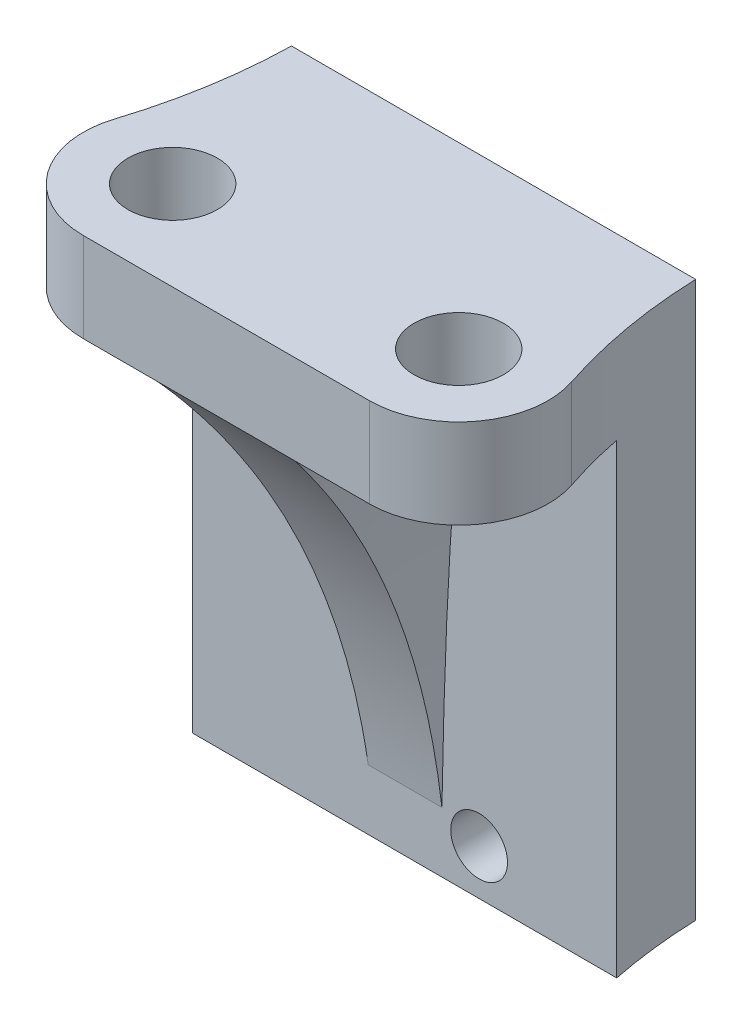
ISO-10303-21;
HEADER;
FILE_DESCRIPTION(('STEP AP214'),'2;1');
FILE_NAME('part.step','',(''),(''),'','','');
FILE_SCHEMA(('AUTOMOTIVE_DESIGN { 1 0 10303 214 1 1 1 1 }'));
ENDSEC;
DATA;
#1=APPLICATION_CONTEXT('core data for automotive mechanical design processes');
#2=APPLICATION_PROTOCOL_DEFINITION('international standard','automotive_design',2000,#1);
#3=PRODUCT_CONTEXT('',#1,'mechanical');
#4=PRODUCT('Part','Part','',(#3));
#5=PRODUCT_RELATED_PRODUCT_CATEGORY('part','',(#4));
#6=PRODUCT_DEFINITION_FORMATION('','',#4);
#7=PRODUCT_DEFINITION_CONTEXT('part definition',#1,'design');
#8=PRODUCT_DEFINITION('design','',#6,#7);
#9=PRODUCT_DEFINITION_SHAPE('','',#8);
#10=(LENGTH_UNIT() NAMED_UNIT(*) SI_UNIT(.MILLI.,.METRE.));
#11=(NAMED_UNIT(*) PLANE_ANGLE_UNIT() SI_UNIT($,.RADIAN.));
#12=(NAMED_UNIT(*) SI_UNIT($,.STERADIAN.) SOLID_ANGLE_UNIT());
#13=UNCERTAINTY_MEASURE_WITH_UNIT(LENGTH_MEASURE(1.E-05),#10,'distance_accuracy_value','');
#14=(GEOMETRIC_REPRESENTATION_CONTEXT(3) GLOBAL_UNCERTAINTY_ASSIGNED_CONTEXT((#13)) GLOBAL_UNIT_ASSIGNED_CONTEXT((#10,
#11,#12)) REPRESENTATION_CONTEXT('',''));
#15=CARTESIAN_POINT('',(0.,0.,0.));
#16=DIRECTION('',(0.,0.,1.));
#17=DIRECTION('',(1.,0.,0.));
#18=AXIS2_PLACEMENT_3D('',#15,#16,#17);
#19=CARTESIAN_POINT('',(0.,0.,5.));
#20=DIRECTION('',(0.,0.,1.));
#21=DIRECTION('',(1.,0.,0.));
#22=AXIS2_PLACEMENT_3D('',#19,#20,#21);
#23=PLANE('',#22);
#24=CARTESIAN_POINT('',(-7.112,3.048,5.));
#25=DIRECTION('',(0.,0.,-1.));
#26=DIRECTION('',(-1.,0.,0.));
#27=AXIS2_PLACEMENT_3D('',#24,#25,#26);
#28=CIRCLE('',#27,1.5875);
#29=CARTESIAN_POINT('',(-8.6995,3.048,5.));
#30=VERTEX_POINT('',#29);
#31=EDGE_CURVE('E171',#30,#30,#28,.T.);
#32=ORIENTED_EDGE('',*,*,#31,.T.);
#33=EDGE_LOOP('',(#32));
#34=FACE_BOUND('',#33,.T.);
#35=DIRECTION('',(1.,0.,0.));
#36=VECTOR('',#35,1.);
#37=CARTESIAN_POINT('',(-24.253,3.88413526493205,4.99999999999999));
#38=LINE('',#37,#36);
#39=CARTESIAN_POINT('',(-13.3135692830577,3.88413526493205,5.));
#40=VERTEX_POINT('',#39);
#41=CARTESIAN_POINT('',(-9.19243071694235,3.88413526493205,5.));
#42=VERTEX_POINT('',#41);
#43=EDGE_CURVE('E290',#40,#42,#38,.T.);
#44=ORIENTED_EDGE('',*,*,#43,.F.);
#45=CARTESIAN_POINT('',(-15.253,26.557,5.));
#46=CARTESIAN_POINT('',(-13.253,26.557,5.));
#47=CARTESIAN_POINT('',(-13.253,-3.443,5.));
#48=(BOUNDED_CURVE() B_SPLINE_CURVE(2,(#45,#46,#47),.UNSPECIFIED.,.F.,
.F.) B_SPLINE_CURVE_WITH_KNOTS((3,3),(0.,1.),
.UNSPECIFIED.) CURVE() GEOMETRIC_REPRESENTATION_ITEM() RATIONAL_B_SPLINE_CURVE((1.,
0.707106781186547,1.)) REPRESENTATION_ITEM(''));
#49=CARTESIAN_POINT('',(-15.253,26.557,5.));
#50=VERTEX_POINT('',#49);
#51=EDGE_CURVE('E285',#40,#50,#48,.F.);
#52=ORIENTED_EDGE('',*,*,#51,.T.);
#53=DIRECTION('',(-1.,0.,0.));
#54=VECTOR('',#53,1.);
#55=CARTESIAN_POINT('',(-26.7344594927863,26.557,5.));
#56=LINE('',#55,#54);
#57=CARTESIAN_POINT('',(-23.132587354687,26.557,5.));
#58=VERTEX_POINT('',#57);
#59=EDGE_CURVE('E194',#50,#58,#56,.T.);
#60=ORIENTED_EDGE('',*,*,#59,.T.);
#61=DIRECTION('',(0.,-1.,0.));
#62=VECTOR('',#61,1.);
#63=CARTESIAN_POINT('',(-23.132587354687,26.557,5.));
#64=LINE('',#63,#62);
#65=CARTESIAN_POINT('',(-23.132587354687,0.507999999999998,5.));
#66=VERTEX_POINT('',#65);
#67=EDGE_CURVE('E394',#58,#66,#64,.T.);
#68=ORIENTED_EDGE('',*,*,#67,.T.);
#69=DIRECTION('',(1.,0.,0.));
#70=VECTOR('',#69,1.);
#71=CARTESIAN_POINT('',(-22.606,0.507999999999998,5.));
#72=LINE('',#71,#70);
#73=CARTESIAN_POINT('',(0.583812344139491,0.507999999999998,5.));
#74=VERTEX_POINT('',#73);
#75=EDGE_CURVE('E64',#66,#74,#72,.T.);
#76=ORIENTED_EDGE('',*,*,#75,.T.);
#77=DIRECTION('',(0.,1.,0.));
#78=VECTOR('',#77,1.);
#79=CARTESIAN_POINT('',(0.583812344139492,0.507999999999998,5.));
#80=LINE('',#79,#78);
#81=CARTESIAN_POINT('',(0.583812344139501,26.557,5.));
#82=VERTEX_POINT('',#81);
#83=EDGE_CURVE('E400',#74,#82,#80,.T.);
#84=ORIENTED_EDGE('',*,*,#83,.T.);
#85=CARTESIAN_POINT('',(-7.25300000000001,26.557,5.));
#86=VERTEX_POINT('',#85);
#87=EDGE_CURVE('E57',#82,#86,#56,.T.);
#88=ORIENTED_EDGE('',*,*,#87,.T.);
#89=CARTESIAN_POINT('',(-9.253,-3.443,5.));
#90=CARTESIAN_POINT('',(-9.253,26.557,5.));
#91=CARTESIAN_POINT('',(-7.25300000000001,26.557,5.));
#92=(BOUNDED_CURVE() B_SPLINE_CURVE(2,(#89,#90,#91),.UNSPECIFIED.,.F.,
.F.) B_SPLINE_CURVE_WITH_KNOTS((3,3),(0.,1.),
.UNSPECIFIED.) CURVE() GEOMETRIC_REPRESENTATION_ITEM() RATIONAL_B_SPLINE_CURVE((1.,
0.707106781186548,1.)) REPRESENTATION_ITEM(''));
#93=EDGE_CURVE('E133',#86,#42,#92,.F.);
#94=ORIENTED_EDGE('',*,*,#93,.T.);
#95=EDGE_LOOP('',(#44,#52,#60,#68,#76,#84,#88,#94));
#96=FACE_BOUND('',#95,.T.);
#97=CARTESIAN_POINT('',(-20.066,20.066,5.));
#98=DIRECTION('',(0.,0.,-1.));
#99=DIRECTION('',(-1.,0.,0.));
#100=AXIS2_PLACEMENT_3D('',#97,#98,#99);
#101=CIRCLE('',#100,1.5875);
#102=CARTESIAN_POINT('',(-21.6535,20.066,5.));
#103=VERTEX_POINT('',#102);
#104=EDGE_CURVE('E170',#103,#103,#101,.T.);
#105=ORIENTED_EDGE('',*,*,#104,.T.);
#106=EDGE_LOOP('',(#105));
#107=FACE_BOUND('',#106,.T.);
#108=ADVANCED_FACE('F42',(#34,#96,#107),#23,.T.);
#109=CARTESIAN_POINT('',(0.,26.557,0.));
#110=DIRECTION('',(0.,-1.,0.));
#111=DIRECTION('',(1.,0.,0.));
#112=AXIS2_PLACEMENT_3D('',#109,#110,#111);
#113=PLANE('',#112);
#114=CARTESIAN_POINT('',(-3.25299999999999,26.557,10.));
#115=DIRECTION('',(0.,-1.,0.));
#116=DIRECTION('',(1.,0.,0.));
#117=AXIS2_PLACEMENT_3D('',#114,#115,#116);
#118=CIRCLE('',#117,2.5);
#119=CARTESIAN_POINT('',(-0.752999999999993,26.557,10.));
#120=VERTEX_POINT('',#119);
#121=EDGE_CURVE('E410',#120,#120,#118,.T.);
#122=ORIENTED_EDGE('',*,*,#121,.F.);
#123=EDGE_LOOP('',(#122));
#124=FACE_BOUND('',#123,.T.);
#125=DIRECTION('',(-1.,0.,0.));
#126=VECTOR('',#125,1.);
#127=CARTESIAN_POINT('',(0.,26.557,15.));
#128=LINE('',#127,#126);
#129=CARTESIAN_POINT('',(-3.25299999999999,26.557,15.));
#130=VERTEX_POINT('',#129);
#131=CARTESIAN_POINT('',(-7.25300000000001,26.557,15.));
#132=VERTEX_POINT('',#131);
#133=EDGE_CURVE('E127',#130,#132,#128,.T.);
#134=ORIENTED_EDGE('',*,*,#133,.T.);
#135=CARTESIAN_POINT('',(-7.25300000000001,26.557,4.5));
#136=CARTESIAN_POINT('',(-7.25300000000001,26.557,8.16666666666668));
#137=CARTESIAN_POINT('',(-7.25300000000001,26.557,11.8333333333333));
#138=CARTESIAN_POINT('',(-7.25300000000001,26.557,15.5));
#139=(BOUNDED_CURVE() B_SPLINE_CURVE(3,(#135,#136,#137,#138),.UNSPECIFIED.,.F.,
.F.) B_SPLINE_CURVE_WITH_KNOTS((4,4),(-0.000499999999999999,0.0105),
.UNSPECIFIED.) CURVE() GEOMETRIC_REPRESENTATION_ITEM() RATIONAL_B_SPLINE_CURVE((1.,1.,1.,1.)) REPRESENTATION_ITEM(''));
#140=EDGE_CURVE('E217',#132,#86,#139,.F.);
#141=ORIENTED_EDGE('',*,*,#140,.T.);
#142=ORIENTED_EDGE('',*,*,#87,.F.);
#143=CARTESIAN_POINT('',(29.9844120910371,26.557,-0.966970296785682));
#144=DIRECTION('',(0.,-1.,0.));
#145=DIRECTION('',(1.,0.,0.));
#146=AXIS2_PLACEMENT_3D('',#143,#144,#145);
#147=CIRCLE('',#146,30.);
#148=CARTESIAN_POINT('',(1.49520172729103,26.557,8.43328995760204));
#149=VERTEX_POINT('',#148);
#150=EDGE_CURVE('E50',#82,#149,#147,.F.);
#151=ORIENTED_EDGE('',*,*,#150,.T.);
#152=CARTESIAN_POINT('',(-3.25299999999999,26.557,10.));
#153=DIRECTION('',(0.,-1.,0.));
#154=DIRECTION('',(1.,0.,0.));
#155=AXIS2_PLACEMENT_3D('',#152,#153,#154);
#156=CIRCLE('',#155,5.00000000000001);
#157=EDGE_CURVE('E124',#149,#130,#156,.T.);
#158=ORIENTED_EDGE('',*,*,#157,.T.);
#159=EDGE_LOOP('',(#134,#141,#142,#151,#158));
#160=FACE_BOUND('',#159,.T.);
#161=ADVANCED_FACE('F126',(#124,#160),#113,.T.);
#162=CARTESIAN_POINT('',(-19.253,26.557,10.));
#163=DIRECTION('',(0.,-1.,0.));
#164=DIRECTION('',(1.,0.,0.));
#165=AXIS2_PLACEMENT_3D('',#162,#163,#164);
#166=CIRCLE('',#165,2.5);
#167=CARTESIAN_POINT('',(-16.753,26.557,10.));
#168=VERTEX_POINT('',#167);
#169=EDGE_CURVE('E160',#168,#168,#166,.T.);
#170=ORIENTED_EDGE('',*,*,#169,.F.);
#171=EDGE_LOOP('',(#170));
#172=FACE_BOUND('',#171,.T.);
#173=ORIENTED_EDGE('',*,*,#59,.F.);
#174=CARTESIAN_POINT('',(-15.253,26.557,15.5));
#175=CARTESIAN_POINT('',(-15.253,26.557,11.8333333333333));
#176=CARTESIAN_POINT('',(-15.253,26.557,8.16666666666667));
#177=CARTESIAN_POINT('',(-15.253,26.557,4.5));
#178=(BOUNDED_CURVE() B_SPLINE_CURVE(3,(#174,#175,#176,#177),.UNSPECIFIED.,.F.,
.F.) B_SPLINE_CURVE_WITH_KNOTS((4,4),(-0.0105,0.000499999999999998),
.UNSPECIFIED.) CURVE() GEOMETRIC_REPRESENTATION_ITEM() RATIONAL_B_SPLINE_CURVE((1.,1.,1.,1.)) REPRESENTATION_ITEM(''));
#179=CARTESIAN_POINT('',(-15.253,26.557,15.));
#180=VERTEX_POINT('',#179);
#181=EDGE_CURVE('E295',#50,#180,#178,.F.);
#182=ORIENTED_EDGE('',*,*,#181,.T.);
#183=CARTESIAN_POINT('',(-19.253,26.557,15.));
#184=VERTEX_POINT('',#183);
#185=EDGE_CURVE('E144',#180,#184,#128,.T.);
#186=ORIENTED_EDGE('',*,*,#185,.T.);
#187=CARTESIAN_POINT('',(-19.253,26.557,10.));
#188=DIRECTION('',(0.,-1.,0.));
#189=DIRECTION('',(1.,0.,0.));
#190=AXIS2_PLACEMENT_3D('',#187,#188,#189);
#191=CIRCLE('',#190,5.);
#192=CARTESIAN_POINT('',(-24.0167658913414,26.557,8.48127206765248));
#193=VERTEX_POINT('',#192);
#194=EDGE_CURVE('E143',#184,#193,#191,.T.);
#195=ORIENTED_EDGE('',*,*,#194,.T.);
#196=CARTESIAN_POINT('',(-52.5993612393896,26.557,-0.631095526432667));
#197=DIRECTION('',(0.,-1.,0.));
#198=DIRECTION('',(1.,0.,0.));
#199=AXIS2_PLACEMENT_3D('',#196,#197,#198);
#200=CIRCLE('',#199,30.);
#201=EDGE_CURVE('E300',#193,#58,#200,.F.);
#202=ORIENTED_EDGE('',*,*,#201,.T.);
#203=EDGE_LOOP('',(#173,#182,#186,#195,#202));
#204=FACE_BOUND('',#203,.T.);
#205=ADVANCED_FACE('F232',(#172,#204),#113,.T.);
#206=CARTESIAN_POINT('',(0.,31.557,15.));
#207=DIRECTION('',(0.,0.,-1.));
#208=DIRECTION('',(-1.,0.,0.));
#209=AXIS2_PLACEMENT_3D('',#206,#207,#208);
#210=PLANE('',#209);
#211=ORIENTED_EDGE('',*,*,#185,.F.);
#212=DIRECTION('',(1.,0.,0.));
#213=VECTOR('',#212,1.);
#214=CARTESIAN_POINT('',(-24.253,26.557,15.));
#215=LINE('',#214,#213);
#216=EDGE_CURVE('E142',#180,#132,#215,.T.);
#217=ORIENTED_EDGE('',*,*,#216,.T.);
#218=ORIENTED_EDGE('',*,*,#133,.F.);
#219=DIRECTION('',(0.,-1.,0.));
#220=VECTOR('',#219,1.);
#221=CARTESIAN_POINT('',(-3.25299999999999,31.557,15.));
#222=LINE('',#221,#220);
#223=CARTESIAN_POINT('',(-3.25299999999999,31.557,15.));
#224=VERTEX_POINT('',#223);
#225=EDGE_CURVE('E140',#224,#130,#222,.T.);
#226=ORIENTED_EDGE('',*,*,#225,.F.);
#227=DIRECTION('',(1.,0.,0.));
#228=VECTOR('',#227,1.);
#229=CARTESIAN_POINT('',(0.,31.557,15.));
#230=LINE('',#229,#228);
#231=CARTESIAN_POINT('',(-19.253,31.557,15.));
#232=VERTEX_POINT('',#231);
#233=EDGE_CURVE('E168',#232,#224,#230,.T.);
#234=ORIENTED_EDGE('',*,*,#233,.F.);
#235=DIRECTION('',(0.,-1.,0.));
#236=VECTOR('',#235,1.);
#237=CARTESIAN_POINT('',(-19.253,31.557,15.));
#238=LINE('',#237,#236);
#239=EDGE_CURVE('E154',#232,#184,#238,.T.);
#240=ORIENTED_EDGE('',*,*,#239,.T.);
#241=EDGE_LOOP('',(#211,#217,#218,#226,#234,#240));
#242=FACE_BOUND('',#241,.T.);
#243=ADVANCED_FACE('F138',(#242),#210,.F.);
#244=CARTESIAN_POINT('',(-19.253,31.557,10.));
#245=DIRECTION('',(0.,-1.,0.));
#246=DIRECTION('',(1.,0.,0.));
#247=AXIS2_PLACEMENT_3D('',#244,#245,#246);
#248=CYLINDRICAL_SURFACE('',#247,2.5);
#249=CARTESIAN_POINT('',(-19.253,31.557,10.));
#250=DIRECTION('',(0.,1.,0.));
#251=DIRECTION('',(-1.,0.,0.));
#252=AXIS2_PLACEMENT_3D('',#249,#250,#251);
#253=CIRCLE('',#252,2.5);
#254=CARTESIAN_POINT('',(-21.753,31.557,10.));
#255=VERTEX_POINT('',#254);
#256=EDGE_CURVE('E152',#255,#255,#253,.T.);
#257=ORIENTED_EDGE('',*,*,#256,.T.);
#258=EDGE_LOOP('',(#257));
#259=FACE_BOUND('',#258,.T.);
#260=ORIENTED_EDGE('',*,*,#169,.T.);
#261=EDGE_LOOP('',(#260));
#262=FACE_BOUND('',#261,.T.);
#263=ADVANCED_FACE('F247',(#259,#262),#248,.F.);
#264=CARTESIAN_POINT('',(-3.253,31.557,10.));
#265=DIRECTION('',(0.,-1.,0.));
#266=DIRECTION('',(1.,0.,0.));
#267=AXIS2_PLACEMENT_3D('',#264,#265,#266);
#268=CYLINDRICAL_SURFACE('',#267,2.5);
#269=CARTESIAN_POINT('',(-3.253,31.557,10.));
#270=DIRECTION('',(0.,1.,0.));
#271=DIRECTION('',(-1.,0.,0.));
#272=AXIS2_PLACEMENT_3D('',#269,#270,#271);
#273=CIRCLE('',#272,2.5);
#274=CARTESIAN_POINT('',(-5.753,31.557,10.));
#275=VERTEX_POINT('',#274);
#276=EDGE_CURVE('E149',#275,#275,#273,.T.);
#277=ORIENTED_EDGE('',*,*,#276,.T.);
#278=EDGE_LOOP('',(#277));
#279=FACE_BOUND('',#278,.T.);
#280=ORIENTED_EDGE('',*,*,#121,.T.);
#281=EDGE_LOOP('',(#280));
#282=FACE_BOUND('',#281,.T.);
#283=ADVANCED_FACE('F243',(#279,#282),#268,.F.);
#284=CARTESIAN_POINT('',(-19.253,31.557,10.));
#285=DIRECTION('',(0.,-1.,0.));
#286=DIRECTION('',(1.,0.,0.));
#287=AXIS2_PLACEMENT_3D('',#284,#285,#286);
#288=CYLINDRICAL_SURFACE('',#287,5.);
#289=CARTESIAN_POINT('',(-19.253,31.557,10.));
#290=DIRECTION('',(0.,1.,0.));
#291=DIRECTION('',(1.,0.,0.));
#292=AXIS2_PLACEMENT_3D('',#289,#290,#291);
#293=CIRCLE('',#292,5.);
#294=CARTESIAN_POINT('',(-24.0167658913414,31.557,8.48127206765248));
#295=VERTEX_POINT('',#294);
#296=EDGE_CURVE('E158',#295,#232,#293,.T.);
#297=ORIENTED_EDGE('',*,*,#296,.F.);
#298=DIRECTION('',(0.,-1.,0.));
#299=VECTOR('',#298,1.);
#300=CARTESIAN_POINT('',(-24.0167658913414,31.557,8.48127206765248));
#301=LINE('',#300,#299);
#302=EDGE_CURVE('E367',#295,#193,#301,.T.);
#303=ORIENTED_EDGE('',*,*,#302,.T.);
#304=ORIENTED_EDGE('',*,*,#194,.F.);
#305=ORIENTED_EDGE('',*,*,#239,.F.);
#306=EDGE_LOOP('',(#297,#303,#304,#305));
#307=FACE_BOUND('',#306,.T.);
#308=ADVANCED_FACE('F240',(#307),#288,.T.);
#309=CARTESIAN_POINT('',(-3.253,31.557,10.));
#310=DIRECTION('',(0.,-1.,0.));
#311=DIRECTION('',(1.,0.,0.));
#312=AXIS2_PLACEMENT_3D('',#309,#310,#311);
#313=CYLINDRICAL_SURFACE('',#312,5.00000000000001);
#314=ORIENTED_EDGE('',*,*,#157,.F.);
#315=DIRECTION('',(0.,-1.,0.));
#316=VECTOR('',#315,1.);
#317=CARTESIAN_POINT('',(1.49520172729103,31.557,8.43328995760204));
#318=LINE('',#317,#316);
#319=CARTESIAN_POINT('',(1.49520172729103,31.557,8.43328995760204));
#320=VERTEX_POINT('',#319);
#321=EDGE_CURVE('E389',#149,#320,#318,.F.);
#322=ORIENTED_EDGE('',*,*,#321,.T.);
#323=CARTESIAN_POINT('',(-3.253,31.557,10.));
#324=DIRECTION('',(0.,1.,0.));
#325=DIRECTION('',(-1.,0.,0.));
#326=AXIS2_PLACEMENT_3D('',#323,#324,#325);
#327=CIRCLE('',#326,5.00000000000001);
#328=EDGE_CURVE('E148',#224,#320,#327,.T.);
#329=ORIENTED_EDGE('',*,*,#328,.F.);
#330=ORIENTED_EDGE('',*,*,#225,.T.);
#331=EDGE_LOOP('',(#314,#322,#329,#330));
#332=FACE_BOUND('',#331,.T.);
#333=ADVANCED_FACE('F146',(#332),#313,.T.);
#334=CARTESIAN_POINT('',(-22.606,0.507999999999998,5.));
#335=DIRECTION('',(0.,1.,0.));
#336=DIRECTION('',(0.,0.,1.));
#337=AXIS2_PLACEMENT_3D('',#334,#335,#336);
#338=PLANE('',#337);
#339=DIRECTION('',(1.,0.,0.));
#340=VECTOR('',#339,1.);
#341=CARTESIAN_POINT('',(-22.606,0.507999999999998,0.));
#342=LINE('',#341,#340);
#343=CARTESIAN_POINT('',(-22.606,0.507999999999998,0.));
#344=VERTEX_POINT('',#343);
#345=CARTESIAN_POINT('',(0.,0.507999999999998,0.));
#346=VERTEX_POINT('',#345);
#347=EDGE_CURVE('E182',#344,#346,#342,.T.);
#348=ORIENTED_EDGE('',*,*,#347,.T.);
#349=CARTESIAN_POINT('',(29.9844120910371,0.507999999999998,-0.966970296785682));
#350=DIRECTION('',(0.,1.,0.));
#351=DIRECTION('',(0.,0.,1.));
#352=AXIS2_PLACEMENT_3D('',#349,#350,#351);
#353=CIRCLE('',#352,30.);
#354=EDGE_CURVE('E398',#346,#74,#353,.T.);
#355=ORIENTED_EDGE('',*,*,#354,.T.);
#356=ORIENTED_EDGE('',*,*,#75,.F.);
#357=CARTESIAN_POINT('',(-52.5993612393896,0.507999999999998,-0.631095526432667));
#358=DIRECTION('',(0.,1.,0.));
#359=DIRECTION('',(0.,0.,1.));
#360=AXIS2_PLACEMENT_3D('',#357,#358,#359);
#361=CIRCLE('',#360,30.);
#362=EDGE_CURVE('E396',#66,#344,#361,.T.);
#363=ORIENTED_EDGE('',*,*,#362,.T.);
#364=EDGE_LOOP('',(#348,#355,#356,#363));
#365=FACE_BOUND('',#364,.T.);
#366=ADVANCED_FACE('F239',(#365),#338,.F.);
#367=CARTESIAN_POINT('',(0.,0.,0.));
#368=DIRECTION('',(0.,0.,1.));
#369=DIRECTION('',(1.,0.,0.));
#370=AXIS2_PLACEMENT_3D('',#367,#368,#369);
#371=PLANE('',#370);
#372=CARTESIAN_POINT('',(-7.112,3.048,0.));
#373=DIRECTION('',(0.,0.,1.));
#374=DIRECTION('',(1.,0.,0.));
#375=AXIS2_PLACEMENT_3D('',#372,#373,#374);
#376=CIRCLE('',#375,1.5875);
#377=CARTESIAN_POINT('',(-5.5245,3.048,0.));
#378=VERTEX_POINT('',#377);
#379=EDGE_CURVE('E183',#378,#378,#376,.T.);
#380=ORIENTED_EDGE('',*,*,#379,.T.);
#381=EDGE_LOOP('',(#380));
#382=FACE_BOUND('',#381,.T.);
#383=CARTESIAN_POINT('',(-20.066,20.066,0.));
#384=DIRECTION('',(0.,0.,1.));
#385=DIRECTION('',(1.,0.,0.));
#386=AXIS2_PLACEMENT_3D('',#383,#384,#385);
#387=CIRCLE('',#386,1.5875);
#388=CARTESIAN_POINT('',(-18.4785,20.066,0.));
#389=VERTEX_POINT('',#388);
#390=EDGE_CURVE('E174',#389,#389,#387,.T.);
#391=ORIENTED_EDGE('',*,*,#390,.T.);
#392=EDGE_LOOP('',(#391));
#393=FACE_BOUND('',#392,.T.);
#394=DIRECTION('',(0.,-1.,0.));
#395=VECTOR('',#394,1.);
#396=CARTESIAN_POINT('',(-22.606,22.606,0.));
#397=LINE('',#396,#395);
#398=CARTESIAN_POINT('',(-22.606,31.557,0.));
#399=VERTEX_POINT('',#398);
#400=EDGE_CURVE('E179',#399,#344,#397,.T.);
#401=ORIENTED_EDGE('',*,*,#400,.F.);
#402=DIRECTION('',(-1.,0.,0.));
#403=VECTOR('',#402,1.);
#404=CARTESIAN_POINT('',(0.,31.557,0.));
#405=LINE('',#404,#403);
#406=CARTESIAN_POINT('',(0.,31.557,0.));
#407=VERTEX_POINT('',#406);
#408=EDGE_CURVE('E165',#407,#399,#405,.T.);
#409=ORIENTED_EDGE('',*,*,#408,.F.);
#410=DIRECTION('',(0.,1.,0.));
#411=VECTOR('',#410,1.);
#412=CARTESIAN_POINT('',(0.,22.606,0.));
#413=LINE('',#412,#411);
#414=EDGE_CURVE('E178',#346,#407,#413,.T.);
#415=ORIENTED_EDGE('',*,*,#414,.F.);
#416=ORIENTED_EDGE('',*,*,#347,.F.);
#417=EDGE_LOOP('',(#401,#409,#415,#416));
#418=FACE_BOUND('',#417,.T.);
#419=ADVANCED_FACE('F265',(#382,#393,#418),#371,.F.);
#420=CARTESIAN_POINT('',(-20.066,20.066,5.));
#421=DIRECTION('',(0.,0.,-1.));
#422=DIRECTION('',(-1.,0.,0.));
#423=AXIS2_PLACEMENT_3D('',#420,#421,#422);
#424=CYLINDRICAL_SURFACE('',#423,1.5875);
#425=ORIENTED_EDGE('',*,*,#104,.F.);
#426=EDGE_LOOP('',(#425));
#427=FACE_BOUND('',#426,.T.);
#428=ORIENTED_EDGE('',*,*,#390,.F.);
#429=EDGE_LOOP('',(#428));
#430=FACE_BOUND('',#429,.T.);
#431=ADVANCED_FACE('F261',(#427,#430),#424,.F.);
#432=CARTESIAN_POINT('',(-7.112,3.048,5.));
#433=DIRECTION('',(0.,0.,-1.));
#434=DIRECTION('',(-1.,0.,0.));
#435=AXIS2_PLACEMENT_3D('',#432,#433,#434);
#436=CYLINDRICAL_SURFACE('',#435,1.5875);
#437=ORIENTED_EDGE('',*,*,#31,.F.);
#438=EDGE_LOOP('',(#437));
#439=FACE_BOUND('',#438,.T.);
#440=ORIENTED_EDGE('',*,*,#379,.F.);
#441=EDGE_LOOP('',(#440));
#442=FACE_BOUND('',#441,.T.);
#443=ADVANCED_FACE('F255',(#439,#442),#436,.F.);
#444=CARTESIAN_POINT('',(0.,31.557,0.));
#445=DIRECTION('',(0.,-1.,0.));
#446=DIRECTION('',(1.,0.,0.));
#447=AXIS2_PLACEMENT_3D('',#444,#445,#446);
#448=PLANE('',#447);
#449=ORIENTED_EDGE('',*,*,#233,.T.);
#450=ORIENTED_EDGE('',*,*,#328,.T.);
#451=CARTESIAN_POINT('',(29.9844120910371,31.557,-0.966970296785682));
#452=DIRECTION('',(0.,-1.,0.));
#453=DIRECTION('',(1.,0.,0.));
#454=AXIS2_PLACEMENT_3D('',#451,#452,#453);
#455=CIRCLE('',#454,30.);
#456=EDGE_CURVE('E13',#320,#407,#455,.T.);
#457=ORIENTED_EDGE('',*,*,#456,.T.);
#458=ORIENTED_EDGE('',*,*,#408,.T.);
#459=CARTESIAN_POINT('',(-52.5993612393896,31.557,-0.631095526432667));
#460=DIRECTION('',(0.,-1.,0.));
#461=DIRECTION('',(1.,0.,0.));
#462=AXIS2_PLACEMENT_3D('',#459,#460,#461);
#463=CIRCLE('',#462,30.);
#464=EDGE_CURVE('E391',#399,#295,#463,.T.);
#465=ORIENTED_EDGE('',*,*,#464,.T.);
#466=ORIENTED_EDGE('',*,*,#296,.T.);
#467=EDGE_LOOP('',(#449,#450,#457,#458,#465,#466));
#468=FACE_BOUND('',#467,.T.);
#469=ORIENTED_EDGE('',*,*,#256,.F.);
#470=EDGE_LOOP('',(#469));
#471=FACE_BOUND('',#470,.T.);
#472=ORIENTED_EDGE('',*,*,#276,.F.);
#473=EDGE_LOOP('',(#472));
#474=FACE_BOUND('',#473,.T.);
#475=ADVANCED_FACE('F252',(#468,#471,#474),#448,.F.);
#476=CARTESIAN_POINT('',(-24.253,3.88413526493205,4.99999999999999));
#477=CARTESIAN_POINT('',(-24.253,16.8418515831609,6.71936009348223));
#478=CARTESIAN_POINT('',(-24.253,26.557,15.));
#479=B_SPLINE_CURVE_WITH_KNOTS('',2,(#476,#477,#478),.UNSPECIFIED.,.F.,.F.,(3,3),(0.,1.),.UNSPECIFIED.);
#480=DIRECTION('',(1.,0.,0.));
#481=VECTOR('',#480,1.);
#482=SURFACE_OF_LINEAR_EXTRUSION('',#479,#481);
#483=ORIENTED_EDGE('',*,*,#216,.F.);
#484=CARTESIAN_POINT('',(-15.253,26.557,15.));
#485=CARTESIAN_POINT('',(-15.2512159033299,26.557000134753,15.0000001152465));
#486=CARTESIAN_POINT('',(-15.2494318561064,26.5569646160214,14.9999698407212));
#487=CARTESIAN_POINT('',(-15.2458641094707,26.5568230269518,14.9998491587848));
#488=CARTESIAN_POINT('',(-15.2440804221324,26.5567167800459,14.9997586008805));
#489=CARTESIAN_POINT('',(-15.2405134121252,26.5564337666466,14.999517382349));
#490=CARTESIAN_POINT('',(-15.23873013927,26.5562566374758,14.9993664126178));
#491=CARTESIAN_POINT('',(-15.2351639066912,26.5558320836693,14.9990045671142));
#492=CARTESIAN_POINT('',(-15.2333810574994,26.5555841224782,14.9987932340888));
#493=CARTESIAN_POINT('',(-15.2298156096177,26.555018060519,14.9983108025452));
#494=CARTESIAN_POINT('',(-15.2280332016925,26.554699265306,14.9980391123001));
#495=CARTESIAN_POINT('',(-15.2244685520333,26.5539916870086,14.9974361055125));
#496=CARTESIAN_POINT('',(-15.2226865960943,26.5536020716919,14.997104079963));
#497=CARTESIAN_POINT('',(-15.2191227532478,26.5527529789788,14.9963805218226));
#498=CARTESIAN_POINT('',(-15.2173412569282,26.5522925537974,14.9959881819634));
#499=CARTESIAN_POINT('',(-15.2137782274253,26.5513019444223,14.9951440972473));
#500=CARTESIAN_POINT('',(-15.2119971943037,26.5507707201618,14.9946914667673));
#501=CARTESIAN_POINT('',(-15.2084349819068,26.5496385910921,14.9937268840325));
#502=CARTESIAN_POINT('',(-15.2066544121714,26.5490365769645,14.9932139875016));
#503=CARTESIAN_POINT('',(-15.2030930183359,26.5477629230265,14.9921289379261));
#504=CARTESIAN_POINT('',(-15.201312909242,26.5470901264814,14.9915558006341));
#505=CARTESIAN_POINT('',(-15.1977523333837,26.5456749404003,14.9903503180524));
#506=CARTESIAN_POINT('',(-15.1959726798893,26.5449313666278,14.9897169655842));
#507=CARTESIAN_POINT('',(-15.1924129198006,26.5433746388004,14.9883910862929));
#508=CARTESIAN_POINT('',(-15.1906337152199,26.5425602905473,14.9876975443709));
#509=CARTESIAN_POINT('',(-15.1870747673737,26.5408620089607,14.9862513070596));
#510=CARTESIAN_POINT('',(-15.1852960038589,26.5399768864126,14.9854976014436));
#511=CARTESIAN_POINT('',(-15.1817378640723,26.5381370367142,14.983931047254));
#512=CARTESIAN_POINT('',(-15.1799595335461,26.5371811376601,14.9831172038799));
#513=CARTESIAN_POINT('',(-15.1764021961423,26.5351997028432,14.981430376141));
#514=CARTESIAN_POINT('',(-15.1746242890875,26.5341730222989,14.980556420805));
#515=CARTESIAN_POINT('',(-15.1710677516492,26.5320499841201,14.9787493662291));
#516=CARTESIAN_POINT('',(-15.169290263739,26.5309525163922,14.9778153263294));
#517=CARTESIAN_POINT('',(-15.165734509946,26.5286878502219,14.975888090671));
#518=CARTESIAN_POINT('',(-15.1639574178179,26.5275195817284,14.9748939891566));
#519=CARTESIAN_POINT('',(-15.1604024849848,26.5251132769418,14.9728466344064));
#520=CARTESIAN_POINT('',(-15.1586258412586,26.5238742149837,14.9717925140382));
#521=CARTESIAN_POINT('',(-15.1532241910492,26.5200018421792,14.9684984955471));
#522=CARTESIAN_POINT('',(-15.1496742412997,26.5173073471413,14.9662069411206));
#523=CARTESIAN_POINT('',(-15.1425666076607,26.5116425954239,14.9613904951723));
#524=CARTESIAN_POINT('',(-15.1390186262259,26.5086652963477,14.9588596777272));
#525=CARTESIAN_POINT('',(-15.1319146701355,26.5024337841614,14.9535640837512));
#526=CARTESIAN_POINT('',(-15.1283682138045,26.499173255297,14.9507940141984));
#527=CARTESIAN_POINT('',(-15.1212675824543,26.492374484514,14.9450196304962));
#528=CARTESIAN_POINT('',(-15.117722634464,26.4888306246095,14.9420106317041));
#529=CARTESIAN_POINT('',(-15.1106253183557,26.4814643380984,14.9357580929301));
#530=CARTESIAN_POINT('',(-15.107081799466,26.4776369238666,14.9325104192347));
#531=CARTESIAN_POINT('',(-15.0999876567839,26.4697027649311,14.9257803467513));
#532=CARTESIAN_POINT('',(-15.0964454550179,26.4655915981143,14.9222943098819));
#533=CARTESIAN_POINT('',(-15.089354630883,26.4570891836066,14.915087372267));
#534=CARTESIAN_POINT('',(-15.085813998153,26.4526940115588,14.9113632711458));
#535=CARTESIAN_POINT('',(-15.0749354699357,26.4387727112369,14.8995721217623));
#536=CARTESIAN_POINT('',(-15.0678767055799,26.4291168131478,14.8914003638785));
#537=CARTESIAN_POINT('',(-15.0537097075116,26.4086915419344,14.8741294215152));
#538=CARTESIAN_POINT('',(-15.0466545281198,26.3979003383578,14.8650131073788));
#539=CARTESIAN_POINT('',(-15.0325005470445,26.3751963847774,14.8458513748981));
#540=CARTESIAN_POINT('',(-15.0254484939897,26.3632659520543,14.8357925714178));
#541=CARTESIAN_POINT('',(-15.0113080595605,26.3382776669066,14.814746614014));
#542=CARTESIAN_POINT('',(-15.0042610444717,26.3252053641465,14.8037490352178));
#543=CARTESIAN_POINT('',(-14.9823004043947,26.2828190670827,14.7681310734563));
#544=CARTESIAN_POINT('',(-14.9683102874531,26.25320073391,14.743304991539));
#545=CARTESIAN_POINT('',(-14.9400986636575,26.1894456254786,14.6900055676256));
#546=CARTESIAN_POINT('',(-14.9261041404009,26.1552418574502,14.6614951134368));
#547=CARTESIAN_POINT('',(-14.9023593670853,26.0937114000224,14.6103610682127));
#548=CARTESIAN_POINT('',(-14.8923378267761,26.0664618815217,14.5877690935633));
#549=CARTESIAN_POINT('',(-14.8722460298004,26.0096096918565,14.5407468708871));
#550=CARTESIAN_POINT('',(-14.8622339469849,25.97999052354,14.5163118082396));
#551=CARTESIAN_POINT('',(-14.8310675619626,25.8843209262725,14.4375918373943));
#552=CARTESIAN_POINT('',(-14.8112168284007,25.8178962922073,14.3832482687161));
#553=CARTESIAN_POINT('',(-14.747378940824,25.591117257476,14.1988000727034));
#554=CARTESIAN_POINT('',(-14.7084166425316,25.4291853911865,14.0689208727237));
#555=CARTESIAN_POINT('',(-14.6573288161044,25.1963947400157,13.8848719953064));
#556=CARTESIAN_POINT('',(-14.6426317011458,25.1265892262956,13.8300189867088));
#557=CARTESIAN_POINT('',(-14.5709342367564,24.7735779387641,13.554330105682));
#558=CARTESIAN_POINT('',(-14.5211972301253,24.4869308171575,13.3359794312305));
#559=CARTESIAN_POINT('',(-14.4359681304994,23.9467425319471,12.9349322203752));
#560=CARTESIAN_POINT('',(-14.3994592962407,23.693963611853,12.7514057135681));
#561=CARTESIAN_POINT('',(-14.3266900117976,23.1535512421425,12.3678865085024));
#562=CARTESIAN_POINT('',(-14.2909837249044,22.8653713441895,12.1685564571747));
#563=CARTESIAN_POINT('',(-14.2198977285405,22.2529155434487,11.7559161100978));
#564=CARTESIAN_POINT('',(-14.1849586567254,21.9280667922507,11.5433808849888));
#565=CARTESIAN_POINT('',(-14.1252916805643,21.3378682077114,11.1686689976028));
#566=CARTESIAN_POINT('',(-14.0999177166075,21.0735865049893,11.0049092298064));
#567=CARTESIAN_POINT('',(-14.049887680746,20.5277835615251,10.6749790573497));
#568=CARTESIAN_POINT('',(-14.0253340629517,20.246070042767,10.5091109747786));
#569=CARTESIAN_POINT('',(-13.9769604514135,19.6648930442738,10.1759812038168));
#570=CARTESIAN_POINT('',(-13.9532347369182,19.3652342671835,10.0090465380026));
#571=CARTESIAN_POINT('',(-13.9065226433474,18.7476275523219,9.67485061392122));
#572=CARTESIAN_POINT('',(-13.8836233854074,18.4294818447484,9.50794256925427));
#573=CARTESIAN_POINT('',(-13.8385718400746,17.7743364819512,9.17491881803016));
#574=CARTESIAN_POINT('',(-13.8165008914334,17.4371374150406,9.00918439038482));
#575=CARTESIAN_POINT('',(-13.7731083586106,16.7432904484902,8.6796766204321));
#576=CARTESIAN_POINT('',(-13.7518631668594,16.386442259297,8.51631467761513));
#577=CARTESIAN_POINT('',(-13.7140621272529,15.7217012946394,8.22320646020278));
#578=CARTESIAN_POINT('',(-13.6972790537309,15.4144303252707,8.09207661630478));
#579=CARTESIAN_POINT('',(-13.6645418172667,14.7907593265873,7.83464264783494));
#580=CARTESIAN_POINT('',(-13.6486103128032,14.4742983393408,7.70848324389598));
#581=CARTESIAN_POINT('',(-13.6175738424898,13.8320533400161,7.46137741305563));
#582=CARTESIAN_POINT('',(-13.6024916304677,13.5062091140109,7.34058466148189));
#583=CARTESIAN_POINT('',(-13.5731541569082,12.8449975488166,7.10460467780717));
#584=CARTESIAN_POINT('',(-13.5589218301463,12.5095709942739,6.98958052202332));
#585=CARTESIAN_POINT('',(-13.5312840860386,11.8289918532466,6.76553724313236));
#586=CARTESIAN_POINT('',(-13.517901797932,11.4837814126693,6.65669105557045));
#587=CARTESIAN_POINT('',(-13.4919628443698,10.7834264315474,6.4454094787041));
#588=CARTESIAN_POINT('',(-13.4794294917052,10.4282257540911,6.34315729607517));
#589=CARTESIAN_POINT('',(-13.4563171955806,9.74111541787928,6.15464924718252));
#590=CARTESIAN_POINT('',(-13.4456624631067,9.40937869326169,6.06777134311537));
#591=CARTESIAN_POINT('',(-13.4251896617075,8.74114954192172,5.90093063180505));
#592=CARTESIAN_POINT('',(-13.415379464817,8.40464065156627,5.82103280222769));
#593=CARTESIAN_POINT('',(-13.3965942344746,7.72682955795477,5.66822513699248));
#594=CARTESIAN_POINT('',(-13.3876275199711,7.38551148193016,5.59538473039389));
#595=CARTESIAN_POINT('',(-13.3705290786562,6.69804281606461,5.45676459006905));
#596=CARTESIAN_POINT('',(-13.3624061066061,6.35187714294027,5.39105861688751));
#597=CARTESIAN_POINT('',(-13.3469947014356,5.65467470080828,5.26678134426161));
#598=CARTESIAN_POINT('',(-13.3397154312243,5.30362384816852,5.20828800641015));
#599=CARTESIAN_POINT('',(-13.3259908692915,4.59660951349233,5.09850725880992));
#600=CARTESIAN_POINT('',(-13.3195551201139,4.24063311050575,5.04730181686872));
#601=CARTESIAN_POINT('',(-13.3135692830577,3.88413526493205,5.));
#602=B_SPLINE_CURVE_WITH_KNOTS('',3,(#484,#485,#486,#487,#488,#489,#490,#491,#492,#493,#494,
#495,#496,#497,#498,#499,#500,#501,#502,#503,#504,#505,#506,#507,#508,#509,#510,#511,#512,#513,
#514,#515,#516,#517,#518,#519,#520,#521,#522,#523,#524,#525,#526,#527,#528,#529,#530,#531,#532,
#533,#534,#535,#536,#537,#538,#539,#540,#541,#542,#543,#544,#545,#546,#547,#548,#549,#550,#551,
#552,#553,#554,#555,#556,#557,#558,#559,#560,#561,#562,#563,#564,#565,#566,#567,#568,#569,#570,
#571,#572,#573,#574,#575,#576,#577,#578,#579,#580,#581,#582,#583,#584,#585,#586,#587,#588,#589,
#590,#591,#592,#593,#594,#595,#596,#597,#598,#599,#600,#601),.UNSPECIFIED.,.F.,.F.,(4,2,2,2,2,2,
2,2,2,2,2,2,2,2,2,2,2,2,2,2,2,2,2,2,2,2,2,2,2,2,2,2,2,2,2,2,2,2,2,2,2,2,2,2,2,2,2,2,2,2,2,2,2,2,
2,2,2,2,4),(0.,0.00535160077103179,0.0107166117903422,0.0161094318620971,0.0215442382406699,
0.0270348821753184,0.0325947965856544,0.0382369183863934,0.0439736268682687,0.0498166984645903,
0.0557772772998692,0.0618658601976833,0.06809229434482,0.0744657855573557,0.0809949150367116,
0.0876876625932399,0.0945514345026811,0.101593094404099,0.108818995911572,0.123845277797029,
0.139673662189109,0.15633990473501,0.173874579921949,0.192303882167609,0.211650312325525,
0.231933257798592,0.275370053144484,0.322727900690568,0.374089916664442,0.429520208171027,
0.552765087891399,0.692760626515371,0.803116496970207,0.922152862351483,1.18636961418739,
1.81971879962212,2.08968220288572,3.18056560103233,4.12399756706071,5.18049783548723,
6.34963087549886,7.28537017508096,8.26878799051281,9.30019830050522,10.3800717881464,
11.5090583073961,12.6880094793577,13.6914248798832,14.7144832210841,15.757898093921,
16.8224452955022,17.9089637886751,19.0183563973,20.0475344730668,21.0854510466276,
22.1327169233384,23.1899455039498,24.2577519083343,25.3367521320676),.UNSPECIFIED.);
#603=EDGE_CURVE('E304',#180,#40,#602,.T.);
#604=ORIENTED_EDGE('',*,*,#603,.T.);
#605=ORIENTED_EDGE('',*,*,#43,.T.);
#606=CARTESIAN_POINT('',(-9.19243071694235,3.88413526493205,5.));
#607=CARTESIAN_POINT('',(-9.18645046419446,4.24030050817642,5.04725769118872));
#608=CARTESIAN_POINT('',(-9.18002112680785,4.59594527498529,5.0984117186227));
#609=CARTESIAN_POINT('',(-9.16631095272343,5.30230720485519,5.208076070394));
#610=CARTESIAN_POINT('',(-9.15903962802579,5.65303724566623,5.26650468965778));
#611=CARTESIAN_POINT('',(-9.14364567706141,6.34960877034312,5.3906392861862));
#612=CARTESIAN_POINT('',(-9.13553218455182,6.69546428988352,5.45626754856603));
#613=CARTESIAN_POINT('',(-9.1184542652729,7.38232320491227,5.59471936830619));
#614=CARTESIAN_POINT('',(-9.10949856562012,7.72334163174208,5.6674693949999));
#615=CARTESIAN_POINT('',(-9.09073692121329,8.40056382295791,5.82008373418592));
#616=CARTESIAN_POINT('',(-9.0809392694417,8.73678340526517,5.89987883024562));
#617=CARTESIAN_POINT('',(-9.06049313185521,9.404444205816,6.06650185097888));
#618=CARTESIAN_POINT('',(-9.04985249366151,9.73590183067344,6.1532649929197));
#619=CARTESIAN_POINT('',(-9.0267952620347,10.4217236866326,6.34132466958517));
#620=CARTESIAN_POINT('',(-9.01430519161538,10.7759203295221,6.44322429905404));
#621=CARTESIAN_POINT('',(-8.98845754359232,11.4743371490586,6.65376617898331));
#622=CARTESIAN_POINT('',(-8.9751230394713,11.8186128579715,6.76222706074988));
#623=CARTESIAN_POINT('',(-8.9475856291968,12.4973902408215,6.98546971363541));
#624=CARTESIAN_POINT('',(-8.9334056125841,12.8319491445006,7.10008025520573));
#625=CARTESIAN_POINT('',(-8.90417751552677,13.491490992131,7.335207460309));
#626=CARTESIAN_POINT('',(-8.88915213008559,13.8165325122778,7.45556262910718));
#627=CARTESIAN_POINT('',(-8.85823408209616,14.4572356144679,7.70177209417458));
#628=CARTESIAN_POINT('',(-8.84236393250358,14.7729567613877,7.82747418032519));
#629=CARTESIAN_POINT('',(-8.80975413528827,15.3952095325798,8.08397652230026));
#630=CARTESIAN_POINT('',(-8.79303690416939,15.7018014605122,8.21463341487196));
#631=CARTESIAN_POINT('',(-8.75529681898377,16.3666843479537,8.50737924431442));
#632=CARTESIAN_POINT('',(-8.73404088996634,16.724337322547,8.67088994310018));
#633=CARTESIAN_POINT('',(-8.69062325771823,17.4197458015608,9.00073047411092));
#634=CARTESIAN_POINT('',(-8.66853811866572,17.757702191262,9.16664715294595));
#635=CARTESIAN_POINT('',(-8.6234545373921,18.4143163959614,9.50006609534352));
#636=CARTESIAN_POINT('',(-8.60053760552458,18.7331742328378,9.66718548065103));
#637=CARTESIAN_POINT('',(-8.55378641160569,19.3521614352987,10.0018303320366));
#638=CARTESIAN_POINT('',(-8.53003944643423,19.6524891947318,10.1690011273436));
#639=CARTESIAN_POINT('',(-8.48161997753968,20.2349625548527,10.5026253235582));
#640=CARTESIAN_POINT('',(-8.4570419117682,20.5173040756424,10.6687503649274));
#641=CARTESIAN_POINT('',(-8.40695823060052,21.0643228228143,10.9992121630704));
#642=CARTESIAN_POINT('',(-8.38155529695615,21.3291929762804,11.1632453950951));
#643=CARTESIAN_POINT('',(-8.32177765232737,21.9211421697539,11.538882017734));
#644=CARTESIAN_POINT('',(-8.28675181538184,22.2471414471048,11.7520877664679));
#645=CARTESIAN_POINT('',(-8.21546450822888,22.8616775063488,12.1660126291652));
#646=CARTESIAN_POINT('',(-8.17964873743895,23.1507927040951,12.3659502332392));
#647=CARTESIAN_POINT('',(-8.10671405471365,23.6928957269095,12.7506288792273));
#648=CARTESIAN_POINT('',(-8.0701470117608,23.9464322611028,12.9346995448383));
#649=CARTESIAN_POINT('',(-8.00207589712698,24.3771517445998,13.2544787864902));
#650=CARTESIAN_POINT('',(-7.97210732403896,24.5554661374096,13.3889897008826));
#651=CARTESIAN_POINT('',(-7.91139224176347,24.8885338297811,13.6442000930257));
#652=CARTESIAN_POINT('',(-7.88115951001347,25.0435733654167,13.7646456337222));
#653=CARTESIAN_POINT('',(-7.82763242574925,25.2939107534202,13.96177302458));
#654=CARTESIAN_POINT('',(-7.80596093555705,25.3899051810798,14.0380076011862));
#655=CARTESIAN_POINT('',(-7.76228189056529,25.570122689915,14.1823300648022));
#656=CARTESIAN_POINT('',(-7.74058521204559,25.6544573980262,14.2503717005555));
#657=CARTESIAN_POINT('',(-7.69679548232611,25.8115001382306,14.3780055749417));
#658=CARTESIAN_POINT('',(-7.67509884084282,25.8843309280658,14.4375792228363));
#659=CARTESIAN_POINT('',(-7.64087233645846,25.9888195948756,14.5235873267799));
#660=CARTESIAN_POINT('',(-7.62992369862003,26.0209328055724,14.5500955209257));
#661=CARTESIAN_POINT('',(-7.60793610502748,26.082302015341,14.6008945045187));
#662=CARTESIAN_POINT('',(-7.59697522236993,26.1115801021935,14.6251921783338));
#663=CARTESIAN_POINT('',(-7.57248598369624,26.1735437001073,14.676745669991));
#664=CARTESIAN_POINT('',(-7.55880852438808,26.2061865299044,14.7039827239125));
#665=CARTESIAN_POINT('',(-7.53123671145026,26.2670331937267,14.7548955685958));
#666=CARTESIAN_POINT('',(-7.51756223433149,26.2953026488558,14.7786091262142));
#667=CARTESIAN_POINT('',(-7.49610420878232,26.3357489617675,14.8126188706041));
#668=CARTESIAN_POINT('',(-7.48921669638302,26.3482260290266,14.8231219280897));
#669=CARTESIAN_POINT('',(-7.47539679016997,26.3720765014681,14.843220490182));
#670=CARTESIAN_POINT('',(-7.46850423398437,26.3834640807887,14.8528263600058));
#671=CARTESIAN_POINT('',(-7.45467100411848,26.4051348616392,14.8711243139722));
#672=CARTESIAN_POINT('',(-7.44777523364839,26.4154353882459,14.8798296365539));
#673=CARTESIAN_POINT('',(-7.43392914516035,26.4349317139442,14.8963210753813));
#674=CARTESIAN_POINT('',(-7.42702962596982,26.4441488602748,14.9041240496359));
#675=CARTESIAN_POINT('',(-7.4164005186986,26.4574335441307,14.9153792178392));
#676=CARTESIAN_POINT('',(-7.41293999404185,26.4616289429002,14.9189350042171));
#677=CARTESIAN_POINT('',(-7.40600979316038,26.4697448714097,14.9258160749652));
#678=CARTESIAN_POINT('',(-7.40254771426706,26.4736692166207,14.9291444809824));
#679=CARTESIAN_POINT('',(-7.39561425346484,26.4812427942893,14.9355701023962));
#680=CARTESIAN_POINT('',(-7.3921508578245,26.4848963155611,14.9386708551709));
#681=CARTESIAN_POINT('',(-7.38521427546862,26.4919278907766,14.9446404173659));
#682=CARTESIAN_POINT('',(-7.38174945363306,26.4953107678995,14.9475132320586));
#683=CARTESIAN_POINT('',(-7.37480961412597,26.5018006654796,14.9530261685909));
#684=CARTESIAN_POINT('',(-7.37134328745134,26.5049131005601,14.9556708122563));
#685=CARTESIAN_POINT('',(-7.36440018431603,26.5108615518203,14.9607265422176));
#686=CARTESIAN_POINT('',(-7.36093233721395,26.5137036316315,14.9631427159353));
#687=CARTESIAN_POINT('',(-7.3539856302999,26.51911109405,14.96774091583));
#688=CARTESIAN_POINT('',(-7.35051583204802,26.5216832090998,14.9699286117978));
#689=CARTESIAN_POINT('',(-7.3452381804368,26.5253785324194,14.9730723083378));
#690=CARTESIAN_POINT('',(-7.34350172839171,26.5265613223029,14.9740786418154));
#691=CARTESIAN_POINT('',(-7.34002727513329,26.5288583525031,14.9760331802813));
#692=CARTESIAN_POINT('',(-7.33829038308314,26.5299735656955,14.9769822081777));
#693=CARTESIAN_POINT('',(-7.33481512512365,26.532135394571,14.9788220606066));
#694=CARTESIAN_POINT('',(-7.3330778437856,26.5331830224294,14.9797137422583));
#695=CARTESIAN_POINT('',(-7.32960181723419,26.5352096582985,14.9814388509968));
#696=CARTESIAN_POINT('',(-7.32786412459974,26.5361897133206,14.9822731655923));
#697=CARTESIAN_POINT('',(-7.32438731417372,26.5380811787833,14.9838834890771));
#698=CARTESIAN_POINT('',(-7.32264920659583,26.5389936657176,14.9846604112735));
#699=CARTESIAN_POINT('',(-7.31917161041146,26.5407499771589,14.9861559067318));
#700=CARTESIAN_POINT('',(-7.31743307935668,26.5415949002641,14.9868754127793));
#701=CARTESIAN_POINT('',(-7.3139546924365,26.5432160730574,14.9882560406196));
#702=CARTESIAN_POINT('',(-7.31221573084392,26.5439934340597,14.9889181066366));
#703=CARTESIAN_POINT('',(-7.30873654967099,26.5454794811553,14.990183829257));
#704=CARTESIAN_POINT('',(-7.30699715076513,26.5461892796633,14.990788431579));
#705=CARTESIAN_POINT('',(-7.3035171724509,26.5475402119212,14.9919392136478));
#706=CARTESIAN_POINT('',(-7.3017773306004,26.5481824452882,14.9924863287119));
#707=CARTESIAN_POINT('',(-7.2982965534897,26.549398271417,14.993522137116));
#708=CARTESIAN_POINT('',(-7.29655626461602,26.5499729348751,14.9940117415744));
#709=CARTESIAN_POINT('',(-7.29307468853741,26.5510536615174,14.9949325454922));
#710=CARTESIAN_POINT('',(-7.29133395067531,26.5515607483604,14.9953646163695));
#711=CARTESIAN_POINT('',(-7.28785157729256,26.5525063803048,14.9961703874515));
#712=CARTESIAN_POINT('',(-7.28611039112033,26.5529458823471,14.9965449025364));
#713=CARTESIAN_POINT('',(-7.28262722414548,26.5537564224904,14.9972356148728));
#714=CARTESIAN_POINT('',(-7.28088559335075,26.5541283302303,14.9975525528577));
#715=CARTESIAN_POINT('',(-7.2774016389276,26.5548037808007,14.9981281840241));
#716=CARTESIAN_POINT('',(-7.27565957075403,26.5551080853231,14.998387526132));
#717=CARTESIAN_POINT('',(-7.2721748368071,26.5556484447864,14.9988480545424));
#718=CARTESIAN_POINT('',(-7.27043234115961,26.5558851338733,14.9990497811999));
#719=CARTESIAN_POINT('',(-7.26694683992551,26.5562904099054,14.9993951972009));
#720=CARTESIAN_POINT('',(-7.26520393271307,26.5564594858306,14.999539303257));
#721=CARTESIAN_POINT('',(-7.2617176708138,26.5567296492446,14.9997695697238));
#722=CARTESIAN_POINT('',(-7.25997436037239,26.5568310665944,14.9998560112704));
#723=CARTESIAN_POINT('',(-7.25648737410639,26.5569662233467,14.9999712107129));
#724=CARTESIAN_POINT('',(-7.25474370897605,26.5570001228585,15.0000001050741));
#725=CARTESIAN_POINT('',(-7.25300000000001,26.557,15.));
#726=B_SPLINE_CURVE_WITH_KNOTS('',3,(#606,#607,#608,#609,#610,#611,#612,#613,#614,#615,#616,
#617,#618,#619,#620,#621,#622,#623,#624,#625,#626,#627,#628,#629,#630,#631,#632,#633,#634,#635,
#636,#637,#638,#639,#640,#641,#642,#643,#644,#645,#646,#647,#648,#649,#650,#651,#652,#653,#654,
#655,#656,#657,#658,#659,#660,#661,#662,#663,#664,#665,#666,#667,#668,#669,#670,#671,#672,#673,
#674,#675,#676,#677,#678,#679,#680,#681,#682,#683,#684,#685,#686,#687,#688,#689,#690,#691,#692,
#693,#694,#695,#696,#697,#698,#699,#700,#701,#702,#703,#704,#705,#706,#707,#708,#709,#710,#711,
#712,#713,#714,#715,#716,#717,#718,#719,#720,#721,#722,#723,#724,#725),.UNSPECIFIED.,.F.,.F.,(4,
2,2,2,2,2,2,2,2,2,2,2,2,2,2,2,2,2,2,2,2,2,2,2,2,2,2,2,2,2,2,2,2,2,2,2,2,2,2,2,2,2,2,2,2,2,2,2,2,
2,2,2,2,2,2,2,2,2,2,4),(0.,1.07799357460113,2.14481868794104,3.2010895121432,4.24741936411967,
5.2844198663484,6.31270007490705,7.41890409108668,8.50239835259755,9.56407783342126,
10.6047745389851,11.625258178485,12.6262370964654,13.8075666210213,14.938831204149,
16.0208893451881,17.0543965459268,18.0398280102682,18.9775012185484,20.1506245719683,
21.2104987657255,22.1566856531269,22.8327129700316,23.4285653788024,23.8019883417035,
24.1334880516536,24.4231052962937,24.5522634111817,24.6710345769013,24.8049834086923,
24.9229776920457,24.9760813417123,25.0253156234377,25.0707441523987,25.1124491223879,
25.1319397097695,25.1505424665136,25.1682763959803,25.1851634991944,25.2012293195304,
25.2165035825758,25.2310209364073,25.2380088582408,25.244823260068,25.2514702459295,
25.2579563955815,25.2642887930766,25.2704750534799,25.2765233465152,25.2824424157229,
25.2882415915194,25.2939307964104,25.2995205405631,25.3050219060247,25.3104465181211,
25.3158065030026,25.3211144309363,25.3263832457347,25.3316261816171,25.3368566697182),.UNSPECIFIED.);
#727=EDGE_CURVE('E358',#42,#132,#726,.T.);
#728=ORIENTED_EDGE('',*,*,#727,.T.);
#729=EDGE_LOOP('',(#483,#604,#605,#728));
#730=FACE_BOUND('',#729,.T.);
#731=ADVANCED_FACE('F234',(#730),#482,.F.);
#732=CARTESIAN_POINT('',(-13.253,-3.443,15.5));
#733=CARTESIAN_POINT('',(-13.253,-3.443,11.8333333333333));
#734=CARTESIAN_POINT('',(-13.253,-3.443,8.16666666666667));
#735=CARTESIAN_POINT('',(-13.253,-3.443,4.5));
#736=CARTESIAN_POINT('',(-13.253,26.557,15.5));
#737=CARTESIAN_POINT('',(-13.253,26.557,11.8333333333333));
#738=CARTESIAN_POINT('',(-13.253,26.557,8.16666666666667));
#739=CARTESIAN_POINT('',(-13.253,26.557,4.5));
#740=CARTESIAN_POINT('',(-15.253,26.557,15.5));
#741=CARTESIAN_POINT('',(-15.253,26.557,11.8333333333333));
#742=CARTESIAN_POINT('',(-15.253,26.557,8.16666666666667));
#743=CARTESIAN_POINT('',(-15.253,26.557,4.5));
#744=(BOUNDED_SURFACE() B_SPLINE_SURFACE(2,3,((#732,#733,#734,#735),(#736,#737,#738,#739),(#740,
#741,#742,#743)),.UNSPECIFIED.,.F.,.F.,.F.) B_SPLINE_SURFACE_WITH_KNOTS((3,3),(4,4),(0.,1.),
(-0.0105,0.000499999999999998),
.UNSPECIFIED.) GEOMETRIC_REPRESENTATION_ITEM() RATIONAL_B_SPLINE_SURFACE(((1.,1.,1.,1.),
(0.707106781186547,0.707106781186547,0.707106781186547,0.707106781186547),(1.,1.,1.,1.))) REPRESENTATION_ITEM('') SURFACE());
#745=ORIENTED_EDGE('',*,*,#603,.F.);
#746=ORIENTED_EDGE('',*,*,#181,.F.);
#747=ORIENTED_EDGE('',*,*,#51,.F.);
#748=EDGE_LOOP('',(#745,#746,#747));
#749=FACE_BOUND('',#748,.T.);
#750=ADVANCED_FACE('F303',(#749),#744,.T.);
#751=CARTESIAN_POINT('',(-9.253,-3.443,4.5));
#752=CARTESIAN_POINT('',(-9.253,-3.443,8.16666666666668));
#753=CARTESIAN_POINT('',(-9.253,-3.443,11.8333333333333));
#754=CARTESIAN_POINT('',(-9.253,-3.443,15.5));
#755=CARTESIAN_POINT('',(-9.253,26.557,4.5));
#756=CARTESIAN_POINT('',(-9.253,26.557,8.16666666666668));
#757=CARTESIAN_POINT('',(-9.25300000000001,26.557,11.8333333333333));
#758=CARTESIAN_POINT('',(-9.25300000000001,26.557,15.5));
#759=CARTESIAN_POINT('',(-7.25300000000001,26.557,4.5));
#760=CARTESIAN_POINT('',(-7.25300000000001,26.557,8.16666666666668));
#761=CARTESIAN_POINT('',(-7.25300000000001,26.557,11.8333333333333));
#762=CARTESIAN_POINT('',(-7.25300000000001,26.557,15.5));
#763=(BOUNDED_SURFACE() B_SPLINE_SURFACE(2,3,((#751,#752,#753,#754),(#755,#756,#757,#758),(#759,
#760,#761,#762)),.UNSPECIFIED.,.F.,.F.,.F.) B_SPLINE_SURFACE_WITH_KNOTS((3,3),(4,4),(0.,1.),
(-0.000499999999999999,0.0105),
.UNSPECIFIED.) GEOMETRIC_REPRESENTATION_ITEM() RATIONAL_B_SPLINE_SURFACE(((1.,1.,1.,1.),
(0.707106781186548,0.707106781186548,0.707106781186548,0.707106781186548),(1.,1.,1.,1.))) REPRESENTATION_ITEM('') SURFACE());
#764=ORIENTED_EDGE('',*,*,#93,.F.);
#765=ORIENTED_EDGE('',*,*,#140,.F.);
#766=ORIENTED_EDGE('',*,*,#727,.F.);
#767=EDGE_LOOP('',(#764,#765,#766));
#768=FACE_BOUND('',#767,.T.);
#769=ADVANCED_FACE('F329',(#768),#763,.T.);
#770=CARTESIAN_POINT('',(-52.5993612393896,31.557,-0.631095526432667));
#771=DIRECTION('',(0.,-1.,0.));
#772=DIRECTION('',(1.,0.,0.));
#773=AXIS2_PLACEMENT_3D('',#770,#771,#772);
#774=CYLINDRICAL_SURFACE('',#773,30.);
#775=ORIENTED_EDGE('',*,*,#201,.F.);
#776=ORIENTED_EDGE('',*,*,#302,.F.);
#777=ORIENTED_EDGE('',*,*,#464,.F.);
#778=ORIENTED_EDGE('',*,*,#400,.T.);
#779=ORIENTED_EDGE('',*,*,#362,.F.);
#780=ORIENTED_EDGE('',*,*,#67,.F.);
#781=EDGE_LOOP('',(#775,#776,#777,#778,#779,#780));
#782=FACE_BOUND('',#781,.T.);
#783=ADVANCED_FACE('F483',(#782),#774,.F.);
#784=CARTESIAN_POINT('',(29.9844120910371,31.557,-0.966970296785682));
#785=DIRECTION('',(0.,1.,0.));
#786=DIRECTION('',(-1.,0.,0.));
#787=AXIS2_PLACEMENT_3D('',#784,#785,#786);
#788=CYLINDRICAL_SURFACE('',#787,30.);
#789=ORIENTED_EDGE('',*,*,#456,.F.);
#790=ORIENTED_EDGE('',*,*,#321,.F.);
#791=ORIENTED_EDGE('',*,*,#150,.F.);
#792=ORIENTED_EDGE('',*,*,#83,.F.);
#793=ORIENTED_EDGE('',*,*,#354,.F.);
#794=ORIENTED_EDGE('',*,*,#414,.T.);
#795=EDGE_LOOP('',(#789,#790,#791,#792,#793,#794));
#796=FACE_BOUND('',#795,.T.);
#797=ADVANCED_FACE('F44',(#796),#788,.F.);
#798=CLOSED_SHELL('',(#108,#161,#205,#243,#263,#283,#308,#333,#366,#419,#431,#443,#475,#731,
#750,#769,#783,#797));
#799=MANIFOLD_SOLID_BREP('B2',#798);
#800=ADVANCED_BREP_SHAPE_REPRESENTATION('',(#18,#799),#14);
#801=SHAPE_DEFINITION_REPRESENTATION(#9,#800);
ENDSEC;
END-ISO-10303-21;
